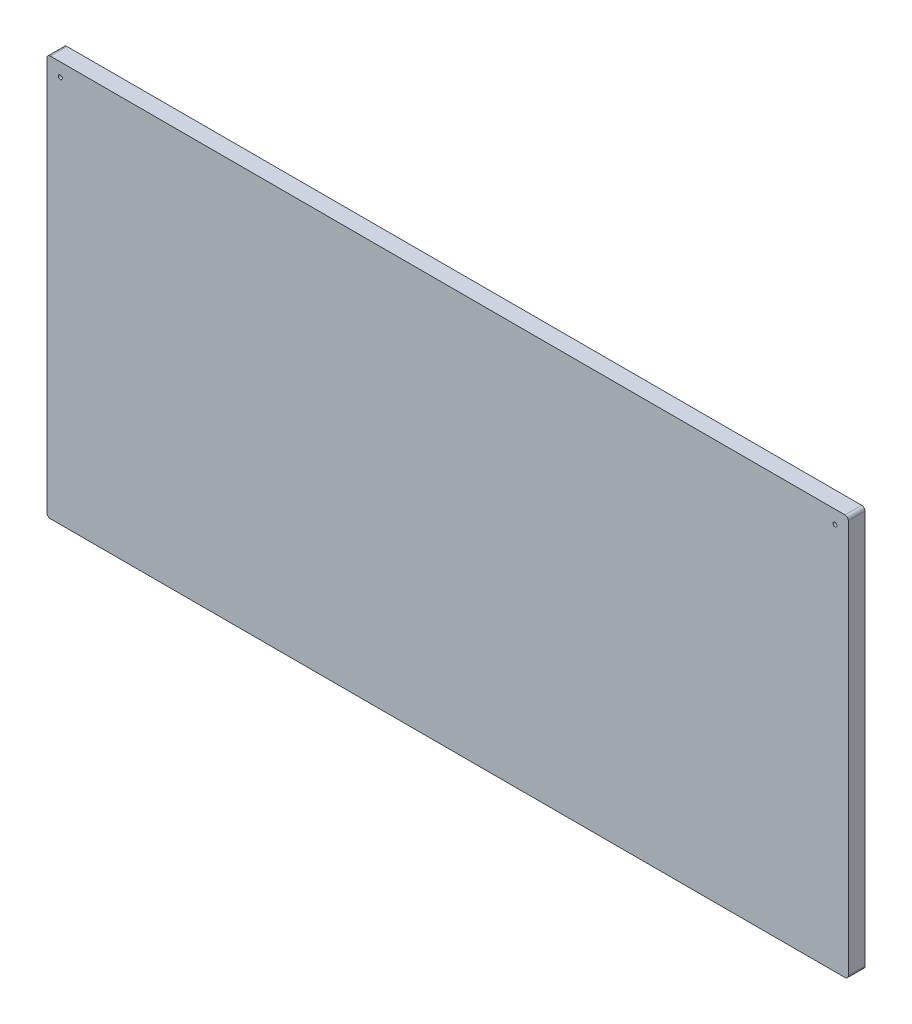
ISO-10303-21;
HEADER;
FILE_DESCRIPTION(('STEP AP214'),'2;1');
FILE_NAME('part.step','',(''),(''),'','','');
FILE_SCHEMA(('AUTOMOTIVE_DESIGN { 1 0 10303 214 1 1 1 1 }'));
ENDSEC;
DATA;
#1=APPLICATION_CONTEXT('core data for automotive mechanical design processes');
#2=APPLICATION_PROTOCOL_DEFINITION('international standard','automotive_design',2000,#1);
#3=PRODUCT_CONTEXT('',#1,'mechanical');
#4=PRODUCT('Part','Part','',(#3));
#5=PRODUCT_RELATED_PRODUCT_CATEGORY('part','',(#4));
#6=PRODUCT_DEFINITION_FORMATION('','',#4);
#7=PRODUCT_DEFINITION_CONTEXT('part definition',#1,'design');
#8=PRODUCT_DEFINITION('design','',#6,#7);
#9=PRODUCT_DEFINITION_SHAPE('','',#8);
#10=(LENGTH_UNIT() NAMED_UNIT(*) SI_UNIT(.MILLI.,.METRE.));
#11=(NAMED_UNIT(*) PLANE_ANGLE_UNIT() SI_UNIT($,.RADIAN.));
#12=(NAMED_UNIT(*) SI_UNIT($,.STERADIAN.) SOLID_ANGLE_UNIT());
#13=UNCERTAINTY_MEASURE_WITH_UNIT(LENGTH_MEASURE(1.E-05),#10,'distance_accuracy_value','');
#14=(GEOMETRIC_REPRESENTATION_CONTEXT(3) GLOBAL_UNCERTAINTY_ASSIGNED_CONTEXT((#13)) GLOBAL_UNIT_ASSIGNED_CONTEXT((#10,
#11,#12)) REPRESENTATION_CONTEXT('',''));
#15=CARTESIAN_POINT('',(0.,0.,0.));
#16=DIRECTION('',(0.,0.,1.));
#17=DIRECTION('',(1.,0.,0.));
#18=AXIS2_PLACEMENT_3D('',#15,#16,#17);
#19=CARTESIAN_POINT('',(595.,295.,-25.));
#20=DIRECTION('',(0.,0.,1.));
#21=DIRECTION('',(1.,0.,0.));
#22=AXIS2_PLACEMENT_3D('',#19,#20,#21);
#23=CYLINDRICAL_SURFACE('',#22,5.);
#24=CARTESIAN_POINT('',(595.,295.,0.));
#25=DIRECTION('',(0.,0.,1.));
#26=DIRECTION('',(-1.,0.,0.));
#27=AXIS2_PLACEMENT_3D('',#24,#25,#26);
#28=CIRCLE('',#27,5.);
#29=CARTESIAN_POINT('',(600.,295.,0.));
#30=VERTEX_POINT('',#29);
#31=CARTESIAN_POINT('',(595.,300.,0.));
#32=VERTEX_POINT('',#31);
#33=EDGE_CURVE('E137',#30,#32,#28,.T.);
#34=ORIENTED_EDGE('',*,*,#33,.F.);
#35=DIRECTION('',(0.,0.,1.));
#36=VECTOR('',#35,1.);
#37=CARTESIAN_POINT('',(600.,295.,-25.));
#38=LINE('',#37,#36);
#39=CARTESIAN_POINT('',(600.,295.,-25.));
#40=VERTEX_POINT('',#39);
#41=EDGE_CURVE('E11',#40,#30,#38,.T.);
#42=ORIENTED_EDGE('',*,*,#41,.F.);
#43=CARTESIAN_POINT('',(595.,295.,-25.));
#44=DIRECTION('',(0.,0.,1.));
#45=DIRECTION('',(-1.,0.,0.));
#46=AXIS2_PLACEMENT_3D('',#43,#44,#45);
#47=CIRCLE('',#46,5.);
#48=CARTESIAN_POINT('',(595.,300.,-25.));
#49=VERTEX_POINT('',#48);
#50=EDGE_CURVE('E160',#40,#49,#47,.T.);
#51=ORIENTED_EDGE('',*,*,#50,.T.);
#52=DIRECTION('',(0.,0.,1.));
#53=VECTOR('',#52,1.);
#54=CARTESIAN_POINT('',(595.,300.,-25.));
#55=LINE('',#54,#53);
#56=EDGE_CURVE('E45',#49,#32,#55,.T.);
#57=ORIENTED_EDGE('',*,*,#56,.T.);
#58=EDGE_LOOP('',(#34,#42,#51,#57));
#59=FACE_BOUND('',#58,.T.);
#60=ADVANCED_FACE('F39',(#59),#23,.T.);
#61=CARTESIAN_POINT('',(600.,-295.,-25.));
#62=DIRECTION('',(1.,0.,0.));
#63=DIRECTION('',(0.,0.,-1.));
#64=AXIS2_PLACEMENT_3D('',#61,#62,#63);
#65=PLANE('',#64);
#66=DIRECTION('',(0.,1.,0.));
#67=VECTOR('',#66,1.);
#68=CARTESIAN_POINT('',(600.,-295.,0.));
#69=LINE('',#68,#67);
#70=CARTESIAN_POINT('',(600.,-295.,0.));
#71=VERTEX_POINT('',#70);
#72=EDGE_CURVE('E154',#71,#30,#69,.T.);
#73=ORIENTED_EDGE('',*,*,#72,.F.);
#74=DIRECTION('',(0.,0.,1.));
#75=VECTOR('',#74,1.);
#76=CARTESIAN_POINT('',(600.,-295.,-25.));
#77=LINE('',#76,#75);
#78=CARTESIAN_POINT('',(600.,-295.,-25.));
#79=VERTEX_POINT('',#78);
#80=EDGE_CURVE('E48',#79,#71,#77,.T.);
#81=ORIENTED_EDGE('',*,*,#80,.F.);
#82=DIRECTION('',(0.,1.,0.));
#83=VECTOR('',#82,1.);
#84=CARTESIAN_POINT('',(600.,-295.,-25.));
#85=LINE('',#84,#83);
#86=EDGE_CURVE('E127',#79,#40,#85,.T.);
#87=ORIENTED_EDGE('',*,*,#86,.T.);
#88=ORIENTED_EDGE('',*,*,#41,.T.);
#89=EDGE_LOOP('',(#73,#81,#87,#88));
#90=FACE_BOUND('',#89,.T.);
#91=ADVANCED_FACE('F166',(#90),#65,.T.);
#92=CARTESIAN_POINT('',(595.,-295.,-25.));
#93=DIRECTION('',(0.,0.,1.));
#94=DIRECTION('',(1.,0.,0.));
#95=AXIS2_PLACEMENT_3D('',#92,#93,#94);
#96=CYLINDRICAL_SURFACE('',#95,5.);
#97=CARTESIAN_POINT('',(595.,-295.,0.));
#98=DIRECTION('',(0.,0.,1.));
#99=DIRECTION('',(1.,0.,0.));
#100=AXIS2_PLACEMENT_3D('',#97,#98,#99);
#101=CIRCLE('',#100,5.);
#102=CARTESIAN_POINT('',(595.,-300.,0.));
#103=VERTEX_POINT('',#102);
#104=EDGE_CURVE('E114',#103,#71,#101,.T.);
#105=ORIENTED_EDGE('',*,*,#104,.F.);
#106=DIRECTION('',(0.,0.,1.));
#107=VECTOR('',#106,1.);
#108=CARTESIAN_POINT('',(595.,-300.,-25.));
#109=LINE('',#108,#107);
#110=CARTESIAN_POINT('',(595.,-300.,-25.));
#111=VERTEX_POINT('',#110);
#112=EDGE_CURVE('E107',#111,#103,#109,.T.);
#113=ORIENTED_EDGE('',*,*,#112,.F.);
#114=CARTESIAN_POINT('',(595.,-295.,-25.));
#115=DIRECTION('',(0.,0.,1.));
#116=DIRECTION('',(1.,0.,0.));
#117=AXIS2_PLACEMENT_3D('',#114,#115,#116);
#118=CIRCLE('',#117,5.);
#119=EDGE_CURVE('E112',#111,#79,#118,.T.);
#120=ORIENTED_EDGE('',*,*,#119,.T.);
#121=ORIENTED_EDGE('',*,*,#80,.T.);
#122=EDGE_LOOP('',(#105,#113,#120,#121));
#123=FACE_BOUND('',#122,.T.);
#124=ADVANCED_FACE('F109',(#123),#96,.T.);
#125=CARTESIAN_POINT('',(-595.,-300.,-25.));
#126=DIRECTION('',(0.,-1.,0.));
#127=DIRECTION('',(0.,0.,-1.));
#128=AXIS2_PLACEMENT_3D('',#125,#126,#127);
#129=PLANE('',#128);
#130=DIRECTION('',(1.,0.,0.));
#131=VECTOR('',#130,1.);
#132=CARTESIAN_POINT('',(-595.,-300.,0.));
#133=LINE('',#132,#131);
#134=CARTESIAN_POINT('',(-595.,-300.,0.));
#135=VERTEX_POINT('',#134);
#136=EDGE_CURVE('E155',#135,#103,#133,.T.);
#137=ORIENTED_EDGE('',*,*,#136,.F.);
#138=DIRECTION('',(0.,0.,1.));
#139=VECTOR('',#138,1.);
#140=CARTESIAN_POINT('',(-595.,-300.,-25.));
#141=LINE('',#140,#139);
#142=CARTESIAN_POINT('',(-595.,-300.,-25.));
#143=VERTEX_POINT('',#142);
#144=EDGE_CURVE('E117',#143,#135,#141,.T.);
#145=ORIENTED_EDGE('',*,*,#144,.F.);
#146=DIRECTION('',(1.,0.,0.));
#147=VECTOR('',#146,1.);
#148=CARTESIAN_POINT('',(-595.,-300.,-25.));
#149=LINE('',#148,#147);
#150=EDGE_CURVE('E121',#143,#111,#149,.T.);
#151=ORIENTED_EDGE('',*,*,#150,.T.);
#152=ORIENTED_EDGE('',*,*,#112,.T.);
#153=EDGE_LOOP('',(#137,#145,#151,#152));
#154=FACE_BOUND('',#153,.T.);
#155=ADVANCED_FACE('F126',(#154),#129,.T.);
#156=CARTESIAN_POINT('',(-595.,-295.,-25.));
#157=DIRECTION('',(0.,0.,1.));
#158=DIRECTION('',(1.,0.,0.));
#159=AXIS2_PLACEMENT_3D('',#156,#157,#158);
#160=CYLINDRICAL_SURFACE('',#159,5.);
#161=CARTESIAN_POINT('',(-595.,-295.,0.));
#162=DIRECTION('',(0.,0.,1.));
#163=DIRECTION('',(-1.,0.,0.));
#164=AXIS2_PLACEMENT_3D('',#161,#162,#163);
#165=CIRCLE('',#164,5.);
#166=CARTESIAN_POINT('',(-600.,-295.,0.));
#167=VERTEX_POINT('',#166);
#168=EDGE_CURVE('E149',#167,#135,#165,.T.);
#169=ORIENTED_EDGE('',*,*,#168,.F.);
#170=DIRECTION('',(0.,0.,1.));
#171=VECTOR('',#170,1.);
#172=CARTESIAN_POINT('',(-600.,-295.,-25.));
#173=LINE('',#172,#171);
#174=CARTESIAN_POINT('',(-600.,-295.,-25.));
#175=VERTEX_POINT('',#174);
#176=EDGE_CURVE('E161',#175,#167,#173,.T.);
#177=ORIENTED_EDGE('',*,*,#176,.F.);
#178=CARTESIAN_POINT('',(-595.,-295.,-25.));
#179=DIRECTION('',(0.,0.,1.));
#180=DIRECTION('',(-1.,0.,0.));
#181=AXIS2_PLACEMENT_3D('',#178,#179,#180);
#182=CIRCLE('',#181,5.);
#183=EDGE_CURVE('E129',#175,#143,#182,.T.);
#184=ORIENTED_EDGE('',*,*,#183,.T.);
#185=ORIENTED_EDGE('',*,*,#144,.T.);
#186=EDGE_LOOP('',(#169,#177,#184,#185));
#187=FACE_BOUND('',#186,.T.);
#188=ADVANCED_FACE('F185',(#187),#160,.T.);
#189=CARTESIAN_POINT('',(-600.,-295.,-25.));
#190=DIRECTION('',(-1.,0.,0.));
#191=DIRECTION('',(0.,0.,1.));
#192=AXIS2_PLACEMENT_3D('',#189,#190,#191);
#193=PLANE('',#192);
#194=DIRECTION('',(0.,-1.,0.));
#195=VECTOR('',#194,1.);
#196=CARTESIAN_POINT('',(-600.,-295.,0.));
#197=LINE('',#196,#195);
#198=CARTESIAN_POINT('',(-600.,295.,0.));
#199=VERTEX_POINT('',#198);
#200=EDGE_CURVE('E148',#199,#167,#197,.T.);
#201=ORIENTED_EDGE('',*,*,#200,.F.);
#202=DIRECTION('',(0.,0.,1.));
#203=VECTOR('',#202,1.);
#204=CARTESIAN_POINT('',(-600.,295.,-25.));
#205=LINE('',#204,#203);
#206=CARTESIAN_POINT('',(-600.,295.,-25.));
#207=VERTEX_POINT('',#206);
#208=EDGE_CURVE('E162',#207,#199,#205,.T.);
#209=ORIENTED_EDGE('',*,*,#208,.F.);
#210=DIRECTION('',(0.,-1.,0.));
#211=VECTOR('',#210,1.);
#212=CARTESIAN_POINT('',(-600.,-295.,-25.));
#213=LINE('',#212,#211);
#214=EDGE_CURVE('E133',#207,#175,#213,.T.);
#215=ORIENTED_EDGE('',*,*,#214,.T.);
#216=ORIENTED_EDGE('',*,*,#176,.T.);
#217=EDGE_LOOP('',(#201,#209,#215,#216));
#218=FACE_BOUND('',#217,.T.);
#219=ADVANCED_FACE('F183',(#218),#193,.T.);
#220=CARTESIAN_POINT('',(-595.,295.,-25.));
#221=DIRECTION('',(0.,0.,1.));
#222=DIRECTION('',(1.,0.,0.));
#223=AXIS2_PLACEMENT_3D('',#220,#221,#222);
#224=CYLINDRICAL_SURFACE('',#223,5.);
#225=CARTESIAN_POINT('',(-595.,295.,0.));
#226=DIRECTION('',(0.,0.,1.));
#227=DIRECTION('',(-1.,0.,0.));
#228=AXIS2_PLACEMENT_3D('',#225,#226,#227);
#229=CIRCLE('',#228,5.);
#230=CARTESIAN_POINT('',(-595.,300.,0.));
#231=VERTEX_POINT('',#230);
#232=EDGE_CURVE('E141',#231,#199,#229,.T.);
#233=ORIENTED_EDGE('',*,*,#232,.F.);
#234=DIRECTION('',(0.,0.,1.));
#235=VECTOR('',#234,1.);
#236=CARTESIAN_POINT('',(-595.,300.,-25.));
#237=LINE('',#236,#235);
#238=CARTESIAN_POINT('',(-595.,300.,-25.));
#239=VERTEX_POINT('',#238);
#240=EDGE_CURVE('E163',#239,#231,#237,.T.);
#241=ORIENTED_EDGE('',*,*,#240,.F.);
#242=CARTESIAN_POINT('',(-595.,295.,-25.));
#243=DIRECTION('',(0.,0.,1.));
#244=DIRECTION('',(-1.,0.,0.));
#245=AXIS2_PLACEMENT_3D('',#242,#243,#244);
#246=CIRCLE('',#245,5.);
#247=EDGE_CURVE('E232',#239,#207,#246,.T.);
#248=ORIENTED_EDGE('',*,*,#247,.T.);
#249=ORIENTED_EDGE('',*,*,#208,.T.);
#250=EDGE_LOOP('',(#233,#241,#248,#249));
#251=FACE_BOUND('',#250,.T.);
#252=ADVANCED_FACE('F190',(#251),#224,.T.);
#253=CARTESIAN_POINT('',(-595.,300.,-25.));
#254=DIRECTION('',(0.,1.,0.));
#255=DIRECTION('',(0.,0.,1.));
#256=AXIS2_PLACEMENT_3D('',#253,#254,#255);
#257=PLANE('',#256);
#258=DIRECTION('',(-1.,0.,0.));
#259=VECTOR('',#258,1.);
#260=CARTESIAN_POINT('',(-595.,300.,0.));
#261=LINE('',#260,#259);
#262=EDGE_CURVE('E136',#32,#231,#261,.T.);
#263=ORIENTED_EDGE('',*,*,#262,.F.);
#264=ORIENTED_EDGE('',*,*,#56,.F.);
#265=DIRECTION('',(-1.,0.,0.));
#266=VECTOR('',#265,1.);
#267=CARTESIAN_POINT('',(-595.,300.,-25.));
#268=LINE('',#267,#266);
#269=EDGE_CURVE('E230',#49,#239,#268,.T.);
#270=ORIENTED_EDGE('',*,*,#269,.T.);
#271=ORIENTED_EDGE('',*,*,#240,.T.);
#272=EDGE_LOOP('',(#263,#264,#270,#271));
#273=FACE_BOUND('',#272,.T.);
#274=ADVANCED_FACE('F167',(#273),#257,.T.);
#275=CARTESIAN_POINT('',(595.,295.,-25.));
#276=DIRECTION('',(0.,0.,-1.));
#277=DIRECTION('',(-1.,0.,0.));
#278=AXIS2_PLACEMENT_3D('',#275,#276,#277);
#279=PLANE('',#278);
#280=CARTESIAN_POINT('',(580.,280.,-25.));
#281=DIRECTION('',(0.,0.,-1.));
#282=DIRECTION('',(-1.,0.,0.));
#283=AXIS2_PLACEMENT_3D('',#280,#281,#282);
#284=CIRCLE('',#283,3.00000000000005);
#285=CARTESIAN_POINT('',(577.,280.,-25.));
#286=VERTEX_POINT('',#285);
#287=EDGE_CURVE('E138',#286,#286,#284,.T.);
#288=ORIENTED_EDGE('',*,*,#287,.F.);
#289=EDGE_LOOP('',(#288));
#290=FACE_BOUND('',#289,.T.);
#291=CARTESIAN_POINT('',(-580.,280.,-25.));
#292=DIRECTION('',(0.,0.,-1.));
#293=DIRECTION('',(-1.,0.,0.));
#294=AXIS2_PLACEMENT_3D('',#291,#292,#293);
#295=CIRCLE('',#294,3.00000000000005);
#296=CARTESIAN_POINT('',(-583.,280.,-25.));
#297=VERTEX_POINT('',#296);
#298=EDGE_CURVE('E218',#297,#297,#295,.T.);
#299=ORIENTED_EDGE('',*,*,#298,.F.);
#300=EDGE_LOOP('',(#299));
#301=FACE_BOUND('',#300,.T.);
#302=ORIENTED_EDGE('',*,*,#50,.F.);
#303=ORIENTED_EDGE('',*,*,#86,.F.);
#304=ORIENTED_EDGE('',*,*,#119,.F.);
#305=ORIENTED_EDGE('',*,*,#150,.F.);
#306=ORIENTED_EDGE('',*,*,#183,.F.);
#307=ORIENTED_EDGE('',*,*,#214,.F.);
#308=ORIENTED_EDGE('',*,*,#247,.F.);
#309=ORIENTED_EDGE('',*,*,#269,.F.);
#310=EDGE_LOOP('',(#302,#303,#304,#305,#306,#307,#308,#309));
#311=FACE_BOUND('',#310,.T.);
#312=ADVANCED_FACE('F125',(#290,#301,#311),#279,.T.);
#313=CARTESIAN_POINT('',(595.,295.,0.));
#314=DIRECTION('',(0.,0.,-1.));
#315=DIRECTION('',(-1.,0.,0.));
#316=AXIS2_PLACEMENT_3D('',#313,#314,#315);
#317=PLANE('',#316);
#318=CARTESIAN_POINT('',(580.,280.,0.));
#319=DIRECTION('',(0.,0.,1.));
#320=DIRECTION('',(1.,0.,0.));
#321=AXIS2_PLACEMENT_3D('',#318,#319,#320);
#322=CIRCLE('',#321,3.00000000000005);
#323=CARTESIAN_POINT('',(583.,280.,0.));
#324=VERTEX_POINT('',#323);
#325=EDGE_CURVE('E217',#324,#324,#322,.T.);
#326=ORIENTED_EDGE('',*,*,#325,.F.);
#327=EDGE_LOOP('',(#326));
#328=FACE_BOUND('',#327,.T.);
#329=CARTESIAN_POINT('',(-580.,280.,0.));
#330=DIRECTION('',(0.,0.,1.));
#331=DIRECTION('',(1.,0.,0.));
#332=AXIS2_PLACEMENT_3D('',#329,#330,#331);
#333=CIRCLE('',#332,3.00000000000005);
#334=CARTESIAN_POINT('',(-577.,280.,0.));
#335=VERTEX_POINT('',#334);
#336=EDGE_CURVE('E219',#335,#335,#333,.T.);
#337=ORIENTED_EDGE('',*,*,#336,.F.);
#338=EDGE_LOOP('',(#337));
#339=FACE_BOUND('',#338,.T.);
#340=ORIENTED_EDGE('',*,*,#33,.T.);
#341=ORIENTED_EDGE('',*,*,#262,.T.);
#342=ORIENTED_EDGE('',*,*,#232,.T.);
#343=ORIENTED_EDGE('',*,*,#200,.T.);
#344=ORIENTED_EDGE('',*,*,#168,.T.);
#345=ORIENTED_EDGE('',*,*,#136,.T.);
#346=ORIENTED_EDGE('',*,*,#104,.T.);
#347=ORIENTED_EDGE('',*,*,#72,.T.);
#348=EDGE_LOOP('',(#340,#341,#342,#343,#344,#345,#346,#347));
#349=FACE_BOUND('',#348,.T.);
#350=ADVANCED_FACE('F169',(#328,#339,#349),#317,.F.);
#351=CARTESIAN_POINT('',(-580.,280.,-27.5));
#352=DIRECTION('',(0.,0.,1.));
#353=DIRECTION('',(1.,0.,0.));
#354=AXIS2_PLACEMENT_3D('',#351,#352,#353);
#355=CYLINDRICAL_SURFACE('',#354,3.00000000000005);
#356=ORIENTED_EDGE('',*,*,#298,.T.);
#357=EDGE_LOOP('',(#356));
#358=FACE_BOUND('',#357,.T.);
#359=ORIENTED_EDGE('',*,*,#336,.T.);
#360=EDGE_LOOP('',(#359));
#361=FACE_BOUND('',#360,.T.);
#362=ADVANCED_FACE('F203',(#358,#361),#355,.F.);
#363=CARTESIAN_POINT('',(580.,280.,-27.5));
#364=DIRECTION('',(0.,0.,1.));
#365=DIRECTION('',(1.,0.,0.));
#366=AXIS2_PLACEMENT_3D('',#363,#364,#365);
#367=CYLINDRICAL_SURFACE('',#366,3.00000000000005);
#368=ORIENTED_EDGE('',*,*,#287,.T.);
#369=EDGE_LOOP('',(#368));
#370=FACE_BOUND('',#369,.T.);
#371=ORIENTED_EDGE('',*,*,#325,.T.);
#372=EDGE_LOOP('',(#371));
#373=FACE_BOUND('',#372,.T.);
#374=ADVANCED_FACE('F208',(#370,#373),#367,.F.);
#375=CLOSED_SHELL('',(#60,#91,#124,#155,#188,#219,#252,#274,#312,#350,#362,#374));
#376=MANIFOLD_SOLID_BREP('B2',#375);
#377=ADVANCED_BREP_SHAPE_REPRESENTATION('',(#18,#376),#14);
#378=SHAPE_DEFINITION_REPRESENTATION(#9,#377);
ENDSEC;
END-ISO-10303-21;
